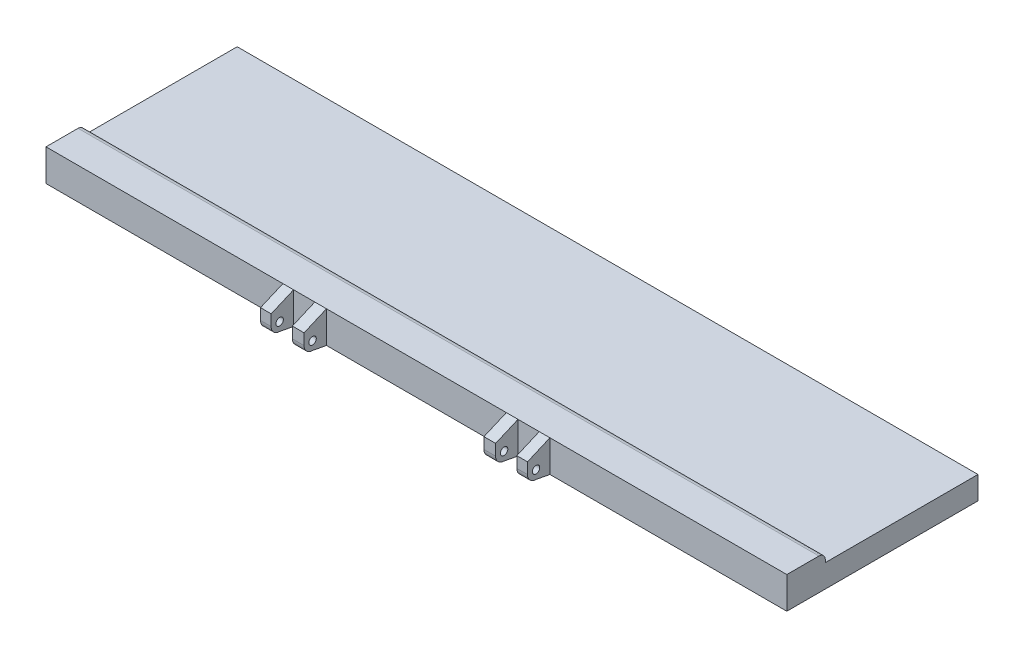
ISO-10303-21;
HEADER;
FILE_DESCRIPTION(('STEP AP214'),'2;1');
FILE_NAME('part.step','',(''),(''),'','','');
FILE_SCHEMA(('AUTOMOTIVE_DESIGN { 1 0 10303 214 1 1 1 1 }'));
ENDSEC;
DATA;
#1=APPLICATION_CONTEXT('core data for automotive mechanical design processes');
#2=APPLICATION_PROTOCOL_DEFINITION('international standard','automotive_design',2000,#1);
#3=PRODUCT_CONTEXT('',#1,'mechanical');
#4=PRODUCT('Part','Part','',(#3));
#5=PRODUCT_RELATED_PRODUCT_CATEGORY('part','',(#4));
#6=PRODUCT_DEFINITION_FORMATION('','',#4);
#7=PRODUCT_DEFINITION_CONTEXT('part definition',#1,'design');
#8=PRODUCT_DEFINITION('design','',#6,#7);
#9=PRODUCT_DEFINITION_SHAPE('','',#8);
#10=(LENGTH_UNIT() NAMED_UNIT(*) SI_UNIT(.MILLI.,.METRE.));
#11=(NAMED_UNIT(*) PLANE_ANGLE_UNIT() SI_UNIT($,.RADIAN.));
#12=(NAMED_UNIT(*) SI_UNIT($,.STERADIAN.) SOLID_ANGLE_UNIT());
#13=UNCERTAINTY_MEASURE_WITH_UNIT(LENGTH_MEASURE(1.E-05),#10,'distance_accuracy_value','');
#14=(GEOMETRIC_REPRESENTATION_CONTEXT(3) GLOBAL_UNCERTAINTY_ASSIGNED_CONTEXT((#13)) GLOBAL_UNIT_ASSIGNED_CONTEXT((#10,
#11,#12)) REPRESENTATION_CONTEXT('',''));
#15=CARTESIAN_POINT('',(0.,0.,0.));
#16=DIRECTION('',(0.,0.,1.));
#17=DIRECTION('',(1.,0.,0.));
#18=AXIS2_PLACEMENT_3D('',#15,#16,#17);
#19=CARTESIAN_POINT('',(-104.943162,25.,0.));
#20=DIRECTION('',(1.,0.,0.));
#21=DIRECTION('',(0.,0.,-1.));
#22=AXIS2_PLACEMENT_3D('',#19,#20,#21);
#23=PLANE('',#22);
#24=CARTESIAN_POINT('',(-104.943162,8.74871946340382,87.8824389342233));
#25=DIRECTION('',(1.,0.,0.));
#26=DIRECTION('',(0.,0.,-1.));
#27=AXIS2_PLACEMENT_3D('',#24,#25,#26);
#28=CIRCLE('',#27,2.91102849999999);
#29=CARTESIAN_POINT('',(-104.943162,8.74871946340382,84.9714104342233));
#30=VERTEX_POINT('',#29);
#31=EDGE_CURVE('E248',#30,#30,#28,.T.);
#32=ORIENTED_EDGE('',*,*,#31,.T.);
#33=EDGE_LOOP('',(#32));
#34=FACE_BOUND('',#33,.T.);
#35=DIRECTION('',(0.,-0.186256622322147,-0.982501130096625));
#36=VECTOR('',#35,1.);
#37=CARTESIAN_POINT('',(-104.943162,-13.2134422400238,7.24427327450433));
#38=LINE('',#37,#36);
#39=CARTESIAN_POINT('',(-104.943162,2.07345352624965,87.8824389342233));
#40=VERTEX_POINT('',#39);
#41=CARTESIAN_POINT('',(-104.943162,0.,76.945));
#42=VERTEX_POINT('',#41);
#43=EDGE_CURVE('E382',#40,#42,#38,.T.);
#44=ORIENTED_EDGE('',*,*,#43,.F.);
#45=CARTESIAN_POINT('',(-104.943162,8.73288769143077,87.8982707061963));
#46=DIRECTION('',(1.,0.,0.));
#47=DIRECTION('',(0.,0.,-1.));
#48=AXIS2_PLACEMENT_3D('',#45,#46,#47);
#49=CIRCLE('',#48,6.65945298394586);
#50=CARTESIAN_POINT('',(-104.943162,8.71705591945721,94.5577048713775));
#51=VERTEX_POINT('',#50);
#52=EDGE_CURVE('E417',#40,#51,#49,.F.);
#53=ORIENTED_EDGE('',*,*,#52,.T.);
#54=DIRECTION('',(0.,-1.,0.));
#55=VECTOR('',#54,1.);
#56=CARTESIAN_POINT('',(-104.943162,25.,94.5577048713773));
#57=LINE('',#56,#55);
#58=CARTESIAN_POINT('',(-104.943162,17.4341118389154,94.5577048713775));
#59=VERTEX_POINT('',#58);
#60=EDGE_CURVE('E298',#59,#51,#57,.T.);
#61=ORIENTED_EDGE('',*,*,#60,.F.);
#62=DIRECTION('',(0.,0.39469422298178,-0.91881253275345));
#63=VECTOR('',#62,1.);
#64=CARTESIAN_POINT('',(-104.943162,52.9041041485132,11.9867636893188));
#65=LINE('',#64,#63);
#66=CARTESIAN_POINT('',(-104.943162,25.,76.9450000000003));
#67=VERTEX_POINT('',#66);
#68=EDGE_CURVE('E399',#59,#67,#65,.T.);
#69=ORIENTED_EDGE('',*,*,#68,.T.);
#70=DIRECTION('',(0.,-1.,0.));
#71=VECTOR('',#70,1.);
#72=CARTESIAN_POINT('',(-104.943162,25.,76.945));
#73=LINE('',#72,#71);
#74=EDGE_CURVE('E301',#67,#42,#73,.T.);
#75=ORIENTED_EDGE('',*,*,#74,.T.);
#76=EDGE_LOOP('',(#44,#53,#61,#69,#75));
#77=FACE_BOUND('',#76,.T.);
#78=ADVANCED_FACE('F44',(#34,#77),#23,.F.);
#79=CARTESIAN_POINT('',(-96.552372,25.,0.));
#80=DIRECTION('',(1.,0.,0.));
#81=DIRECTION('',(0.,0.,-1.));
#82=AXIS2_PLACEMENT_3D('',#79,#80,#81);
#83=PLANE('',#82);
#84=CARTESIAN_POINT('',(-96.552372,8.74871946340382,87.8824389342233));
#85=DIRECTION('',(1.,0.,0.));
#86=DIRECTION('',(0.,0.,-1.));
#87=AXIS2_PLACEMENT_3D('',#84,#85,#86);
#88=CIRCLE('',#87,2.91102849999999);
#89=CARTESIAN_POINT('',(-96.552372,8.74871946340382,84.9714104342233));
#90=VERTEX_POINT('',#89);
#91=EDGE_CURVE('E438',#90,#90,#88,.T.);
#92=ORIENTED_EDGE('',*,*,#91,.F.);
#93=EDGE_LOOP('',(#92));
#94=FACE_BOUND('',#93,.T.);
#95=CARTESIAN_POINT('',(-96.552372,8.73288769143077,87.8982707061963));
#96=DIRECTION('',(1.,0.,0.));
#97=DIRECTION('',(0.,0.,-1.));
#98=AXIS2_PLACEMENT_3D('',#95,#96,#97);
#99=CIRCLE('',#98,6.65945298394586);
#100=CARTESIAN_POINT('',(-96.552372,2.07345352624965,87.8824389342233));
#101=VERTEX_POINT('',#100);
#102=CARTESIAN_POINT('',(-96.552372,8.71705591945721,94.5577048713775));
#103=VERTEX_POINT('',#102);
#104=EDGE_CURVE('E415',#101,#103,#99,.F.);
#105=ORIENTED_EDGE('',*,*,#104,.F.);
#106=DIRECTION('',(0.,-0.186256622322147,-0.982501130096625));
#107=VECTOR('',#106,1.);
#108=CARTESIAN_POINT('',(-96.552372,-13.2134422400238,7.24427327450433));
#109=LINE('',#108,#107);
#110=CARTESIAN_POINT('',(-96.552372,0.,76.9450000000003));
#111=VERTEX_POINT('',#110);
#112=EDGE_CURVE('E379',#101,#111,#109,.T.);
#113=ORIENTED_EDGE('',*,*,#112,.T.);
#114=DIRECTION('',(0.,-1.,0.));
#115=VECTOR('',#114,1.);
#116=CARTESIAN_POINT('',(-96.552372,25.,76.945));
#117=LINE('',#116,#115);
#118=CARTESIAN_POINT('',(-96.552372,25.,76.945));
#119=VERTEX_POINT('',#118);
#120=EDGE_CURVE('E292',#119,#111,#117,.T.);
#121=ORIENTED_EDGE('',*,*,#120,.F.);
#122=DIRECTION('',(0.,0.39469422298178,-0.91881253275345));
#123=VECTOR('',#122,1.);
#124=CARTESIAN_POINT('',(-96.552372,52.9041041485132,11.9867636893188));
#125=LINE('',#124,#123);
#126=CARTESIAN_POINT('',(-96.552372,17.4341118389154,94.5577048713775));
#127=VERTEX_POINT('',#126);
#128=EDGE_CURVE('E397',#127,#119,#125,.T.);
#129=ORIENTED_EDGE('',*,*,#128,.F.);
#130=DIRECTION('',(0.,-1.,0.));
#131=VECTOR('',#130,1.);
#132=CARTESIAN_POINT('',(-96.552372,25.,94.5577048713773));
#133=LINE('',#132,#131);
#134=EDGE_CURVE('E295',#127,#103,#133,.T.);
#135=ORIENTED_EDGE('',*,*,#134,.T.);
#136=EDGE_LOOP('',(#105,#113,#121,#129,#135));
#137=FACE_BOUND('',#136,.T.);
#138=ADVANCED_FACE('F494',(#94,#137),#83,.T.);
#139=CARTESIAN_POINT('',(-79.86659,25.,0.));
#140=DIRECTION('',(1.,0.,0.));
#141=DIRECTION('',(0.,0.,-1.));
#142=AXIS2_PLACEMENT_3D('',#139,#140,#141);
#143=PLANE('',#142);
#144=CARTESIAN_POINT('',(-79.86659,8.74871946340382,87.8824389342232));
#145=DIRECTION('',(1.,0.,0.));
#146=DIRECTION('',(0.,0.,-1.));
#147=AXIS2_PLACEMENT_3D('',#144,#145,#146);
#148=CIRCLE('',#147,2.91102849999999);
#149=CARTESIAN_POINT('',(-79.86659,8.74871946340382,84.9714104342233));
#150=VERTEX_POINT('',#149);
#151=EDGE_CURVE('E435',#150,#150,#148,.T.);
#152=ORIENTED_EDGE('',*,*,#151,.T.);
#153=EDGE_LOOP('',(#152));
#154=FACE_BOUND('',#153,.T.);
#155=DIRECTION('',(0.,-0.186256622322147,-0.982501130096625));
#156=VECTOR('',#155,1.);
#157=CARTESIAN_POINT('',(-79.86659,-13.2134422400238,7.24427327450433));
#158=LINE('',#157,#156);
#159=CARTESIAN_POINT('',(-79.86659,2.07345352624965,87.8824389342232));
#160=VERTEX_POINT('',#159);
#161=CARTESIAN_POINT('',(-79.86659,0.,76.945));
#162=VERTEX_POINT('',#161);
#163=EDGE_CURVE('E377',#160,#162,#158,.T.);
#164=ORIENTED_EDGE('',*,*,#163,.F.);
#165=CARTESIAN_POINT('',(-79.86659,8.73288769143077,87.8982707061963));
#166=DIRECTION('',(1.,0.,0.));
#167=DIRECTION('',(0.,0.,-1.));
#168=AXIS2_PLACEMENT_3D('',#165,#166,#167);
#169=CIRCLE('',#168,6.65945298394586);
#170=CARTESIAN_POINT('',(-79.86659,8.71705591945721,94.5577048713774));
#171=VERTEX_POINT('',#170);
#172=EDGE_CURVE('E412',#160,#171,#169,.F.);
#173=ORIENTED_EDGE('',*,*,#172,.T.);
#174=DIRECTION('',(0.,-1.,0.));
#175=VECTOR('',#174,1.);
#176=CARTESIAN_POINT('',(-79.86659,25.,94.5577048713773));
#177=LINE('',#176,#175);
#178=CARTESIAN_POINT('',(-79.86659,17.4341118389154,94.5577048713774));
#179=VERTEX_POINT('',#178);
#180=EDGE_CURVE('E286',#179,#171,#177,.T.);
#181=ORIENTED_EDGE('',*,*,#180,.F.);
#182=DIRECTION('',(0.,0.39469422298178,-0.91881253275345));
#183=VECTOR('',#182,1.);
#184=CARTESIAN_POINT('',(-79.86659,52.9041041485131,11.9867636893188));
#185=LINE('',#184,#183);
#186=CARTESIAN_POINT('',(-79.86659,25.,76.9450000000003));
#187=VERTEX_POINT('',#186);
#188=EDGE_CURVE('E394',#179,#187,#185,.T.);
#189=ORIENTED_EDGE('',*,*,#188,.T.);
#190=DIRECTION('',(0.,-1.,0.));
#191=VECTOR('',#190,1.);
#192=CARTESIAN_POINT('',(-79.86659,25.,76.945));
#193=LINE('',#192,#191);
#194=EDGE_CURVE('E289',#187,#162,#193,.T.);
#195=ORIENTED_EDGE('',*,*,#194,.T.);
#196=EDGE_LOOP('',(#164,#173,#181,#189,#195));
#197=FACE_BOUND('',#196,.T.);
#198=ADVANCED_FACE('F531',(#154,#197),#143,.F.);
#199=CARTESIAN_POINT('',(-70.69296,25.,0.));
#200=DIRECTION('',(1.,0.,0.));
#201=DIRECTION('',(0.,0.,-1.));
#202=AXIS2_PLACEMENT_3D('',#199,#200,#201);
#203=PLANE('',#202);
#204=CARTESIAN_POINT('',(-70.69296,8.74871946340382,87.8824389342232));
#205=DIRECTION('',(1.,0.,0.));
#206=DIRECTION('',(0.,0.,-1.));
#207=AXIS2_PLACEMENT_3D('',#204,#205,#206);
#208=CIRCLE('',#207,2.91102849999999);
#209=CARTESIAN_POINT('',(-70.69296,8.74871946340382,84.9714104342232));
#210=VERTEX_POINT('',#209);
#211=EDGE_CURVE('E432',#210,#210,#208,.T.);
#212=ORIENTED_EDGE('',*,*,#211,.F.);
#213=EDGE_LOOP('',(#212));
#214=FACE_BOUND('',#213,.T.);
#215=CARTESIAN_POINT('',(-70.69296,8.73288769143077,87.8982707061963));
#216=DIRECTION('',(1.,0.,0.));
#217=DIRECTION('',(0.,0.,-1.));
#218=AXIS2_PLACEMENT_3D('',#215,#216,#217);
#219=CIRCLE('',#218,6.65945298394586);
#220=CARTESIAN_POINT('',(-70.69296,2.07345352624965,87.8824389342232));
#221=VERTEX_POINT('',#220);
#222=CARTESIAN_POINT('',(-70.69296,8.71705591945721,94.5577048713774));
#223=VERTEX_POINT('',#222);
#224=EDGE_CURVE('E410',#221,#223,#219,.F.);
#225=ORIENTED_EDGE('',*,*,#224,.F.);
#226=DIRECTION('',(0.,-0.186256622322147,-0.982501130096625));
#227=VECTOR('',#226,1.);
#228=CARTESIAN_POINT('',(-70.69296,-13.2134422400238,7.24427327450433));
#229=LINE('',#228,#227);
#230=CARTESIAN_POINT('',(-70.69296,0.,76.9450000000003));
#231=VERTEX_POINT('',#230);
#232=EDGE_CURVE('E374',#221,#231,#229,.T.);
#233=ORIENTED_EDGE('',*,*,#232,.T.);
#234=DIRECTION('',(0.,-1.,0.));
#235=VECTOR('',#234,1.);
#236=CARTESIAN_POINT('',(-70.69296,25.,76.945));
#237=LINE('',#236,#235);
#238=CARTESIAN_POINT('',(-70.69296,25.,76.945));
#239=VERTEX_POINT('',#238);
#240=EDGE_CURVE('E280',#239,#231,#237,.T.);
#241=ORIENTED_EDGE('',*,*,#240,.F.);
#242=DIRECTION('',(0.,0.39469422298178,-0.91881253275345));
#243=VECTOR('',#242,1.);
#244=CARTESIAN_POINT('',(-70.69296,52.9041041485131,11.9867636893188));
#245=LINE('',#244,#243);
#246=CARTESIAN_POINT('',(-70.69296,17.4341118389154,94.5577048713774));
#247=VERTEX_POINT('',#246);
#248=EDGE_CURVE('E392',#247,#239,#245,.T.);
#249=ORIENTED_EDGE('',*,*,#248,.F.);
#250=DIRECTION('',(0.,-1.,0.));
#251=VECTOR('',#250,1.);
#252=CARTESIAN_POINT('',(-70.69296,25.,94.5577048713773));
#253=LINE('',#252,#251);
#254=EDGE_CURVE('E283',#247,#223,#253,.T.);
#255=ORIENTED_EDGE('',*,*,#254,.T.);
#256=EDGE_LOOP('',(#225,#233,#241,#249,#255));
#257=FACE_BOUND('',#256,.T.);
#258=ADVANCED_FACE('F597',(#214,#257),#203,.T.);
#259=CARTESIAN_POINT('',(70.6929599999999,25.,-1.11403887767481E-13));
#260=DIRECTION('',(1.,0.,0.));
#261=DIRECTION('',(0.,0.,-1.));
#262=AXIS2_PLACEMENT_3D('',#259,#260,#261);
#263=PLANE('',#262);
#264=CARTESIAN_POINT('',(70.69296,8.74871946340382,87.882438934223));
#265=DIRECTION('',(1.,0.,0.));
#266=DIRECTION('',(0.,0.,-1.));
#267=AXIS2_PLACEMENT_3D('',#264,#265,#266);
#268=CIRCLE('',#267,2.91102849999999);
#269=CARTESIAN_POINT('',(70.69296,8.74871946340382,84.971410434223));
#270=VERTEX_POINT('',#269);
#271=EDGE_CURVE('E429',#270,#270,#268,.T.);
#272=ORIENTED_EDGE('',*,*,#271,.T.);
#273=EDGE_LOOP('',(#272));
#274=FACE_BOUND('',#273,.T.);
#275=DIRECTION('',(0.,-0.186256622322147,-0.982501130096625));
#276=VECTOR('',#275,1.);
#277=CARTESIAN_POINT('',(70.6929599999999,-13.2134422400238,7.24427327450421));
#278=LINE('',#277,#276);
#279=CARTESIAN_POINT('',(70.69296,2.07345352624965,87.882438934223));
#280=VERTEX_POINT('',#279);
#281=CARTESIAN_POINT('',(70.69296,0.,76.945));
#282=VERTEX_POINT('',#281);
#283=EDGE_CURVE('E372',#280,#282,#278,.T.);
#284=ORIENTED_EDGE('',*,*,#283,.F.);
#285=CARTESIAN_POINT('',(70.69296,8.73288769143077,87.8982707061961));
#286=DIRECTION('',(1.,0.,0.));
#287=DIRECTION('',(0.,0.,-1.));
#288=AXIS2_PLACEMENT_3D('',#285,#286,#287);
#289=CIRCLE('',#288,6.65945298394586);
#290=CARTESIAN_POINT('',(70.69296,8.71705591945721,94.5577048713772));
#291=VERTEX_POINT('',#290);
#292=EDGE_CURVE('E407',#280,#291,#289,.F.);
#293=ORIENTED_EDGE('',*,*,#292,.T.);
#294=DIRECTION('',(0.,-1.,0.));
#295=VECTOR('',#294,1.);
#296=CARTESIAN_POINT('',(70.69296,25.,94.5577048713772));
#297=LINE('',#296,#295);
#298=CARTESIAN_POINT('',(70.69296,17.4341118389154,94.5577048713772));
#299=VERTEX_POINT('',#298);
#300=EDGE_CURVE('E274',#299,#291,#297,.T.);
#301=ORIENTED_EDGE('',*,*,#300,.F.);
#302=DIRECTION('',(0.,0.39469422298178,-0.91881253275345));
#303=VECTOR('',#302,1.);
#304=CARTESIAN_POINT('',(70.6929599999999,52.9041041485131,11.9867636893186));
#305=LINE('',#304,#303);
#306=CARTESIAN_POINT('',(70.69296,25.,76.9450000000001));
#307=VERTEX_POINT('',#306);
#308=EDGE_CURVE('E389',#299,#307,#305,.T.);
#309=ORIENTED_EDGE('',*,*,#308,.T.);
#310=DIRECTION('',(0.,-1.,0.));
#311=VECTOR('',#310,1.);
#312=CARTESIAN_POINT('',(70.69296,25.,76.945));
#313=LINE('',#312,#311);
#314=EDGE_CURVE('E277',#307,#282,#313,.T.);
#315=ORIENTED_EDGE('',*,*,#314,.T.);
#316=EDGE_LOOP('',(#284,#293,#301,#309,#315));
#317=FACE_BOUND('',#316,.T.);
#318=ADVANCED_FACE('F470',(#274,#317),#263,.F.);
#319=CARTESIAN_POINT('',(79.8665899999999,25.,-1.2586046232512E-13));
#320=DIRECTION('',(1.,0.,0.));
#321=DIRECTION('',(0.,0.,-1.));
#322=AXIS2_PLACEMENT_3D('',#319,#320,#321);
#323=PLANE('',#322);
#324=CARTESIAN_POINT('',(79.86659,8.74871946340382,87.882438934223));
#325=DIRECTION('',(1.,0.,0.));
#326=DIRECTION('',(0.,0.,-1.));
#327=AXIS2_PLACEMENT_3D('',#324,#325,#326);
#328=CIRCLE('',#327,2.91102849999999);
#329=CARTESIAN_POINT('',(79.86659,8.74871946340382,84.971410434223));
#330=VERTEX_POINT('',#329);
#331=EDGE_CURVE('E426',#330,#330,#328,.T.);
#332=ORIENTED_EDGE('',*,*,#331,.F.);
#333=EDGE_LOOP('',(#332));
#334=FACE_BOUND('',#333,.T.);
#335=CARTESIAN_POINT('',(79.86659,8.73288769143077,87.898270706196));
#336=DIRECTION('',(1.,0.,0.));
#337=DIRECTION('',(0.,0.,-1.));
#338=AXIS2_PLACEMENT_3D('',#335,#336,#337);
#339=CIRCLE('',#338,6.65945298394586);
#340=CARTESIAN_POINT('',(79.86659,2.07345352624965,87.882438934223));
#341=VERTEX_POINT('',#340);
#342=CARTESIAN_POINT('',(79.86659,8.71705591945721,94.5577048713772));
#343=VERTEX_POINT('',#342);
#344=EDGE_CURVE('E405',#341,#343,#339,.F.);
#345=ORIENTED_EDGE('',*,*,#344,.F.);
#346=DIRECTION('',(0.,-0.186256622322147,-0.982501130096625));
#347=VECTOR('',#346,1.);
#348=CARTESIAN_POINT('',(79.8665899999999,-13.2134422400238,7.2442732745042));
#349=LINE('',#348,#347);
#350=CARTESIAN_POINT('',(79.86659,0.,76.945));
#351=VERTEX_POINT('',#350);
#352=EDGE_CURVE('E369',#341,#351,#349,.T.);
#353=ORIENTED_EDGE('',*,*,#352,.T.);
#354=DIRECTION('',(0.,-1.,0.));
#355=VECTOR('',#354,1.);
#356=CARTESIAN_POINT('',(79.86659,25.,76.945));
#357=LINE('',#356,#355);
#358=CARTESIAN_POINT('',(79.86659,25.,76.945));
#359=VERTEX_POINT('',#358);
#360=EDGE_CURVE('E268',#359,#351,#357,.T.);
#361=ORIENTED_EDGE('',*,*,#360,.F.);
#362=DIRECTION('',(0.,0.39469422298178,-0.91881253275345));
#363=VECTOR('',#362,1.);
#364=CARTESIAN_POINT('',(79.8665899999999,52.9041041485131,11.9867636893186));
#365=LINE('',#364,#363);
#366=CARTESIAN_POINT('',(79.86659,17.4341118389154,94.5577048713772));
#367=VERTEX_POINT('',#366);
#368=EDGE_CURVE('E387',#367,#359,#365,.T.);
#369=ORIENTED_EDGE('',*,*,#368,.F.);
#370=DIRECTION('',(0.,-1.,0.));
#371=VECTOR('',#370,1.);
#372=CARTESIAN_POINT('',(79.86659,25.,94.5577048713772));
#373=LINE('',#372,#371);
#374=EDGE_CURVE('E271',#367,#343,#373,.T.);
#375=ORIENTED_EDGE('',*,*,#374,.T.);
#376=EDGE_LOOP('',(#345,#353,#361,#369,#375));
#377=FACE_BOUND('',#376,.T.);
#378=ADVANCED_FACE('F506',(#334,#377),#323,.T.);
#379=CARTESIAN_POINT('',(96.5523719999999,25.,-1.52155315238912E-13));
#380=DIRECTION('',(1.,0.,0.));
#381=DIRECTION('',(0.,0.,-1.));
#382=AXIS2_PLACEMENT_3D('',#379,#380,#381);
#383=PLANE('',#382);
#384=CARTESIAN_POINT('',(96.552372,8.74871946340382,87.882438934223));
#385=DIRECTION('',(1.,0.,0.));
#386=DIRECTION('',(0.,0.,-1.));
#387=AXIS2_PLACEMENT_3D('',#384,#385,#386);
#388=CIRCLE('',#387,2.91102849999999);
#389=CARTESIAN_POINT('',(96.552372,8.74871946340382,84.971410434223));
#390=VERTEX_POINT('',#389);
#391=EDGE_CURVE('E423',#390,#390,#388,.T.);
#392=ORIENTED_EDGE('',*,*,#391,.T.);
#393=EDGE_LOOP('',(#392));
#394=FACE_BOUND('',#393,.T.);
#395=DIRECTION('',(0.,-0.186256622322147,-0.982501130096625));
#396=VECTOR('',#395,1.);
#397=CARTESIAN_POINT('',(96.5523719999999,-13.2134422400238,7.24427327450417));
#398=LINE('',#397,#396);
#399=CARTESIAN_POINT('',(96.552372,2.07345352624965,87.882438934223));
#400=VERTEX_POINT('',#399);
#401=CARTESIAN_POINT('',(96.552372,0.,76.945));
#402=VERTEX_POINT('',#401);
#403=EDGE_CURVE('E367',#400,#402,#398,.T.);
#404=ORIENTED_EDGE('',*,*,#403,.F.);
#405=CARTESIAN_POINT('',(96.552372,8.73288769143077,87.898270706196));
#406=DIRECTION('',(1.,0.,0.));
#407=DIRECTION('',(0.,0.,-1.));
#408=AXIS2_PLACEMENT_3D('',#405,#406,#407);
#409=CIRCLE('',#408,6.65945298394586);
#410=CARTESIAN_POINT('',(96.552372,8.71705591945721,94.5577048713771));
#411=VERTEX_POINT('',#410);
#412=EDGE_CURVE('E402',#400,#411,#409,.F.);
#413=ORIENTED_EDGE('',*,*,#412,.T.);
#414=DIRECTION('',(0.,-1.,0.));
#415=VECTOR('',#414,1.);
#416=CARTESIAN_POINT('',(96.552372,25.,94.5577048713771));
#417=LINE('',#416,#415);
#418=CARTESIAN_POINT('',(96.552372,17.4341118389154,94.5577048713771));
#419=VERTEX_POINT('',#418);
#420=EDGE_CURVE('E262',#419,#411,#417,.T.);
#421=ORIENTED_EDGE('',*,*,#420,.F.);
#422=DIRECTION('',(0.,0.39469422298178,-0.91881253275345));
#423=VECTOR('',#422,1.);
#424=CARTESIAN_POINT('',(96.5523719999999,52.9041041485131,11.9867636893186));
#425=LINE('',#424,#423);
#426=CARTESIAN_POINT('',(96.552372,25.,76.945));
#427=VERTEX_POINT('',#426);
#428=EDGE_CURVE('E384',#419,#427,#425,.T.);
#429=ORIENTED_EDGE('',*,*,#428,.T.);
#430=DIRECTION('',(0.,-1.,0.));
#431=VECTOR('',#430,1.);
#432=CARTESIAN_POINT('',(96.552372,25.,76.945));
#433=LINE('',#432,#431);
#434=EDGE_CURVE('E265',#427,#402,#433,.T.);
#435=ORIENTED_EDGE('',*,*,#434,.T.);
#436=EDGE_LOOP('',(#404,#413,#421,#429,#435));
#437=FACE_BOUND('',#436,.T.);
#438=ADVANCED_FACE('F514',(#394,#437),#383,.F.);
#439=CARTESIAN_POINT('',(104.943162,25.,-1.65378224952135E-13));
#440=DIRECTION('',(1.,0.,0.));
#441=DIRECTION('',(0.,0.,-1.));
#442=AXIS2_PLACEMENT_3D('',#439,#440,#441);
#443=PLANE('',#442);
#444=CARTESIAN_POINT('',(104.943162,8.74871946340382,87.882438934223));
#445=DIRECTION('',(1.,0.,0.));
#446=DIRECTION('',(0.,0.,-1.));
#447=AXIS2_PLACEMENT_3D('',#444,#445,#446);
#448=CIRCLE('',#447,2.91102849999999);
#449=CARTESIAN_POINT('',(104.943162,8.74871946340382,84.971410434223));
#450=VERTEX_POINT('',#449);
#451=EDGE_CURVE('E420',#450,#450,#448,.T.);
#452=ORIENTED_EDGE('',*,*,#451,.F.);
#453=EDGE_LOOP('',(#452));
#454=FACE_BOUND('',#453,.T.);
#455=CARTESIAN_POINT('',(104.943162,8.73288769143077,87.898270706196));
#456=DIRECTION('',(1.,0.,0.));
#457=DIRECTION('',(0.,0.,-1.));
#458=AXIS2_PLACEMENT_3D('',#455,#456,#457);
#459=CIRCLE('',#458,6.65945298394586);
#460=CARTESIAN_POINT('',(104.943162,2.07345352624965,87.882438934223));
#461=VERTEX_POINT('',#460);
#462=CARTESIAN_POINT('',(104.943162,8.71705591945721,94.5577048713771));
#463=VERTEX_POINT('',#462);
#464=EDGE_CURVE('E351',#461,#463,#459,.F.);
#465=ORIENTED_EDGE('',*,*,#464,.F.);
#466=DIRECTION('',(0.,-0.186256622322147,-0.982501130096625));
#467=VECTOR('',#466,1.);
#468=CARTESIAN_POINT('',(104.943162,-14.0807304739951,2.66933972651691));
#469=LINE('',#468,#467);
#470=CARTESIAN_POINT('',(104.943162,0.,76.945));
#471=VERTEX_POINT('',#470);
#472=EDGE_CURVE('E348',#461,#471,#469,.T.);
#473=ORIENTED_EDGE('',*,*,#472,.T.);
#474=DIRECTION('',(0.,-1.,0.));
#475=VECTOR('',#474,1.);
#476=CARTESIAN_POINT('',(104.943162,25.,76.945));
#477=LINE('',#476,#475);
#478=CARTESIAN_POINT('',(104.943162,25.,76.945));
#479=VERTEX_POINT('',#478);
#480=EDGE_CURVE('E255',#479,#471,#477,.T.);
#481=ORIENTED_EDGE('',*,*,#480,.F.);
#482=DIRECTION('',(0.,0.39469422298178,-0.91881253275345));
#483=VECTOR('',#482,1.);
#484=CARTESIAN_POINT('',(104.943162,49.0095159071333,21.0530136563447));
#485=LINE('',#484,#483);
#486=CARTESIAN_POINT('',(104.943162,17.4341118389154,94.5577048713771));
#487=VERTEX_POINT('',#486);
#488=EDGE_CURVE('E343',#487,#479,#485,.T.);
#489=ORIENTED_EDGE('',*,*,#488,.F.);
#490=DIRECTION('',(0.,-1.,0.));
#491=VECTOR('',#490,1.);
#492=CARTESIAN_POINT('',(104.943162,25.,94.5577048713771));
#493=LINE('',#492,#491);
#494=EDGE_CURVE('E259',#487,#463,#493,.T.);
#495=ORIENTED_EDGE('',*,*,#494,.T.);
#496=EDGE_LOOP('',(#465,#473,#481,#489,#495));
#497=FACE_BOUND('',#496,.T.);
#498=ADVANCED_FACE('F525',(#454,#497),#443,.T.);
#499=CARTESIAN_POINT('',(0.,0.,0.));
#500=DIRECTION('',(0.,1.,0.));
#501=DIRECTION('',(0.,0.,1.));
#502=AXIS2_PLACEMENT_3D('',#499,#500,#501);
#503=PLANE('',#502);
#504=DIRECTION('',(0.,0.,1.));
#505=VECTOR('',#504,1.);
#506=CARTESIAN_POINT('',(-291.17,0.,0.));
#507=LINE('',#506,#505);
#508=CARTESIAN_POINT('',(-291.17,0.,-73.3326422229955));
#509=VERTEX_POINT('',#508);
#510=CARTESIAN_POINT('',(-291.17,0.,76.945));
#511=VERTEX_POINT('',#510);
#512=EDGE_CURVE('E233',#509,#511,#507,.T.);
#513=ORIENTED_EDGE('',*,*,#512,.F.);
#514=DIRECTION('',(1.,0.,0.));
#515=VECTOR('',#514,1.);
#516=CARTESIAN_POINT('',(-291.17,0.,-73.3326422229955));
#517=LINE('',#516,#515);
#518=CARTESIAN_POINT('',(291.17,0.,-73.3326422229955));
#519=VERTEX_POINT('',#518);
#520=EDGE_CURVE('E220',#509,#519,#517,.T.);
#521=ORIENTED_EDGE('',*,*,#520,.T.);
#522=DIRECTION('',(0.,0.,1.));
#523=VECTOR('',#522,1.);
#524=CARTESIAN_POINT('',(291.17,0.,0.));
#525=LINE('',#524,#523);
#526=CARTESIAN_POINT('',(291.17,0.,76.945));
#527=VERTEX_POINT('',#526);
#528=EDGE_CURVE('E243',#519,#527,#525,.T.);
#529=ORIENTED_EDGE('',*,*,#528,.T.);
#530=DIRECTION('',(1.,0.,0.));
#531=VECTOR('',#530,1.);
#532=CARTESIAN_POINT('',(0.,0.,76.945));
#533=LINE('',#532,#531);
#534=EDGE_CURVE('E247',#471,#527,#533,.T.);
#535=ORIENTED_EDGE('',*,*,#534,.F.);
#536=DIRECTION('',(1.,0.,0.));
#537=VECTOR('',#536,1.);
#538=CARTESIAN_POINT('',(1.21256376084247E-13,0.,76.9450000000002));
#539=LINE('',#538,#537);
#540=EDGE_CURVE('E306',#402,#471,#539,.T.);
#541=ORIENTED_EDGE('',*,*,#540,.F.);
#542=EDGE_CURVE('E511',#351,#402,#533,.T.);
#543=ORIENTED_EDGE('',*,*,#542,.F.);
#544=EDGE_CURVE('E308',#282,#351,#539,.T.);
#545=ORIENTED_EDGE('',*,*,#544,.F.);
#546=EDGE_CURVE('E467',#231,#282,#533,.T.);
#547=ORIENTED_EDGE('',*,*,#546,.F.);
#548=EDGE_CURVE('E664',#162,#231,#539,.T.);
#549=ORIENTED_EDGE('',*,*,#548,.F.);
#550=EDGE_CURVE('E245',#111,#162,#533,.T.);
#551=ORIENTED_EDGE('',*,*,#550,.F.);
#552=EDGE_CURVE('E309',#42,#111,#539,.T.);
#553=ORIENTED_EDGE('',*,*,#552,.F.);
#554=EDGE_CURVE('E242',#511,#42,#533,.T.);
#555=ORIENTED_EDGE('',*,*,#554,.F.);
#556=EDGE_LOOP('',(#513,#521,#529,#535,#541,#543,#545,#547,#549,#551,#553,#555));
#557=FACE_BOUND('',#556,.T.);
#558=ADVANCED_FACE('F239',(#557),#503,.F.);
#559=CARTESIAN_POINT('',(291.17,25.,0.));
#560=DIRECTION('',(1.,0.,0.));
#561=DIRECTION('',(0.,0.,-1.));
#562=AXIS2_PLACEMENT_3D('',#559,#560,#561);
#563=PLANE('',#562);
#564=DIRECTION('',(0.,1.,0.));
#565=VECTOR('',#564,1.);
#566=CARTESIAN_POINT('',(291.17,0.,-73.3326422229955));
#567=LINE('',#566,#565);
#568=CARTESIAN_POINT('',(291.17,18.,-73.3326422229955));
#569=VERTEX_POINT('',#568);
#570=EDGE_CURVE('E223',#519,#569,#567,.T.);
#571=ORIENTED_EDGE('',*,*,#570,.T.);
#572=DIRECTION('',(0.,0.,-1.));
#573=VECTOR('',#572,1.);
#574=CARTESIAN_POINT('',(291.17,18.,46.7170680224697));
#575=LINE('',#574,#573);
#576=CARTESIAN_POINT('',(291.17,18.,46.7170680224697));
#577=VERTEX_POINT('',#576);
#578=EDGE_CURVE('E341',#577,#569,#575,.T.);
#579=ORIENTED_EDGE('',*,*,#578,.F.);
#580=DIRECTION('',(0.,1.,0.));
#581=VECTOR('',#580,1.);
#582=CARTESIAN_POINT('',(291.17,18.,46.7170680224697));
#583=LINE('',#582,#581);
#584=CARTESIAN_POINT('',(291.17,20.,46.7170680224697));
#585=VERTEX_POINT('',#584);
#586=EDGE_CURVE('E324',#577,#585,#583,.T.);
#587=ORIENTED_EDGE('',*,*,#586,.T.);
#588=CARTESIAN_POINT('',(291.17,20.,51.7170680224697));
#589=DIRECTION('',(1.,0.,0.));
#590=DIRECTION('',(0.,0.,-1.));
#591=AXIS2_PLACEMENT_3D('',#588,#589,#590);
#592=CIRCLE('',#591,5.);
#593=CARTESIAN_POINT('',(291.17,25.,51.7170680224697));
#594=VERTEX_POINT('',#593);
#595=EDGE_CURVE('E317',#585,#594,#592,.T.);
#596=ORIENTED_EDGE('',*,*,#595,.T.);
#597=DIRECTION('',(0.,0.,1.));
#598=VECTOR('',#597,1.);
#599=CARTESIAN_POINT('',(291.17,25.,0.));
#600=LINE('',#599,#598);
#601=CARTESIAN_POINT('',(291.17,25.,76.945));
#602=VERTEX_POINT('',#601);
#603=EDGE_CURVE('E321',#594,#602,#600,.T.);
#604=ORIENTED_EDGE('',*,*,#603,.T.);
#605=DIRECTION('',(0.,-1.,0.));
#606=VECTOR('',#605,1.);
#607=CARTESIAN_POINT('',(291.17,25.,76.945));
#608=LINE('',#607,#606);
#609=EDGE_CURVE('E252',#602,#527,#608,.T.);
#610=ORIENTED_EDGE('',*,*,#609,.T.);
#611=ORIENTED_EDGE('',*,*,#528,.F.);
#612=EDGE_LOOP('',(#571,#579,#587,#596,#604,#610,#611));
#613=FACE_BOUND('',#612,.T.);
#614=ADVANCED_FACE('F320',(#613),#563,.T.);
#615=CARTESIAN_POINT('',(-291.17,25.,0.));
#616=DIRECTION('',(1.,0.,0.));
#617=DIRECTION('',(0.,0.,-1.));
#618=AXIS2_PLACEMENT_3D('',#615,#616,#617);
#619=PLANE('',#618);
#620=DIRECTION('',(0.,0.,1.));
#621=VECTOR('',#620,1.);
#622=CARTESIAN_POINT('',(-291.17,18.,46.7170680224697));
#623=LINE('',#622,#621);
#624=CARTESIAN_POINT('',(-291.17,18.,-73.3326422229955));
#625=VERTEX_POINT('',#624);
#626=CARTESIAN_POINT('',(-291.17,18.,46.7170680224697));
#627=VERTEX_POINT('',#626);
#628=EDGE_CURVE('E236',#625,#627,#623,.T.);
#629=ORIENTED_EDGE('',*,*,#628,.F.);
#630=DIRECTION('',(0.,1.,0.));
#631=VECTOR('',#630,1.);
#632=CARTESIAN_POINT('',(-291.17,0.,-73.3326422229955));
#633=LINE('',#632,#631);
#634=EDGE_CURVE('E59',#509,#625,#633,.T.);
#635=ORIENTED_EDGE('',*,*,#634,.F.);
#636=ORIENTED_EDGE('',*,*,#512,.T.);
#637=DIRECTION('',(0.,-1.,0.));
#638=VECTOR('',#637,1.);
#639=CARTESIAN_POINT('',(-291.17,25.,76.945));
#640=LINE('',#639,#638);
#641=CARTESIAN_POINT('',(-291.17,25.,76.945));
#642=VERTEX_POINT('',#641);
#643=EDGE_CURVE('E304',#642,#511,#640,.T.);
#644=ORIENTED_EDGE('',*,*,#643,.F.);
#645=DIRECTION('',(0.,0.,1.));
#646=VECTOR('',#645,1.);
#647=CARTESIAN_POINT('',(-291.17,25.,0.));
#648=LINE('',#647,#646);
#649=CARTESIAN_POINT('',(-291.17,25.,51.7170680224697));
#650=VERTEX_POINT('',#649);
#651=EDGE_CURVE('E331',#650,#642,#648,.T.);
#652=ORIENTED_EDGE('',*,*,#651,.F.);
#653=CARTESIAN_POINT('',(-291.17,20.,51.7170680224697));
#654=DIRECTION('',(1.,0.,0.));
#655=DIRECTION('',(0.,0.,-1.));
#656=AXIS2_PLACEMENT_3D('',#653,#654,#655);
#657=CIRCLE('',#656,5.);
#658=CARTESIAN_POINT('',(-291.17,20.,46.7170680224697));
#659=VERTEX_POINT('',#658);
#660=EDGE_CURVE('E11',#650,#659,#657,.F.);
#661=ORIENTED_EDGE('',*,*,#660,.T.);
#662=DIRECTION('',(0.,1.,0.));
#663=VECTOR('',#662,1.);
#664=CARTESIAN_POINT('',(-291.17,18.,46.7170680224697));
#665=LINE('',#664,#663);
#666=EDGE_CURVE('E335',#627,#659,#665,.T.);
#667=ORIENTED_EDGE('',*,*,#666,.F.);
#668=EDGE_LOOP('',(#629,#635,#636,#644,#652,#661,#667));
#669=FACE_BOUND('',#668,.T.);
#670=ADVANCED_FACE('F231',(#669),#619,.F.);
#671=CARTESIAN_POINT('',(0.,25.,76.945));
#672=DIRECTION('',(0.,0.,-1.));
#673=DIRECTION('',(-1.,0.,0.));
#674=AXIS2_PLACEMENT_3D('',#671,#672,#673);
#675=PLANE('',#674);
#676=ORIENTED_EDGE('',*,*,#554,.T.);
#677=ORIENTED_EDGE('',*,*,#74,.F.);
#678=DIRECTION('',(1.,0.,0.));
#679=VECTOR('',#678,1.);
#680=CARTESIAN_POINT('',(0.,25.,76.945));
#681=LINE('',#680,#679);
#682=EDGE_CURVE('E443',#642,#67,#681,.T.);
#683=ORIENTED_EDGE('',*,*,#682,.F.);
#684=ORIENTED_EDGE('',*,*,#643,.T.);
#685=EDGE_LOOP('',(#676,#677,#683,#684));
#686=FACE_BOUND('',#685,.T.);
#687=ADVANCED_FACE('F569',(#686),#675,.F.);
#688=CARTESIAN_POINT('',(0.,25.,94.5577048713773));
#689=DIRECTION('',(0.,0.,1.));
#690=DIRECTION('',(1.,0.,0.));
#691=AXIS2_PLACEMENT_3D('',#688,#689,#690);
#692=PLANE('',#691);
#693=DIRECTION('',(1.,0.,0.));
#694=VECTOR('',#693,1.);
#695=CARTESIAN_POINT('',(-291.17,8.71705591945721,94.5577048713778));
#696=LINE('',#695,#694);
#697=EDGE_CURVE('E360',#51,#103,#696,.T.);
#698=ORIENTED_EDGE('',*,*,#697,.T.);
#699=ORIENTED_EDGE('',*,*,#134,.F.);
#700=DIRECTION('',(1.,0.,0.));
#701=VECTOR('',#700,1.);
#702=CARTESIAN_POINT('',(-291.17,17.4341118389154,94.5577048713778));
#703=LINE('',#702,#701);
#704=EDGE_CURVE('E352',#59,#127,#703,.T.);
#705=ORIENTED_EDGE('',*,*,#704,.F.);
#706=ORIENTED_EDGE('',*,*,#60,.T.);
#707=EDGE_LOOP('',(#698,#699,#705,#706));
#708=FACE_BOUND('',#707,.T.);
#709=ADVANCED_FACE('F497',(#708),#692,.T.);
#710=ORIENTED_EDGE('',*,*,#550,.T.);
#711=ORIENTED_EDGE('',*,*,#194,.F.);
#712=EDGE_CURVE('E445',#119,#187,#681,.T.);
#713=ORIENTED_EDGE('',*,*,#712,.F.);
#714=ORIENTED_EDGE('',*,*,#120,.T.);
#715=EDGE_LOOP('',(#710,#711,#713,#714));
#716=FACE_BOUND('',#715,.T.);
#717=ADVANCED_FACE('F535',(#716),#675,.F.);
#718=CARTESIAN_POINT('',(0.,25.,94.5577048713773));
#719=DIRECTION('',(0.,0.,1.));
#720=DIRECTION('',(1.,0.,0.));
#721=AXIS2_PLACEMENT_3D('',#718,#719,#720);
#722=PLANE('',#721);
#723=EDGE_CURVE('E499',#171,#223,#696,.T.);
#724=ORIENTED_EDGE('',*,*,#723,.T.);
#725=ORIENTED_EDGE('',*,*,#254,.F.);
#726=EDGE_CURVE('E480',#179,#247,#703,.T.);
#727=ORIENTED_EDGE('',*,*,#726,.F.);
#728=ORIENTED_EDGE('',*,*,#180,.T.);
#729=EDGE_LOOP('',(#724,#725,#727,#728));
#730=FACE_BOUND('',#729,.T.);
#731=ADVANCED_FACE('F602',(#730),#722,.T.);
#732=ORIENTED_EDGE('',*,*,#546,.T.);
#733=ORIENTED_EDGE('',*,*,#314,.F.);
#734=EDGE_CURVE('E450',#239,#307,#681,.T.);
#735=ORIENTED_EDGE('',*,*,#734,.F.);
#736=ORIENTED_EDGE('',*,*,#240,.T.);
#737=EDGE_LOOP('',(#732,#733,#735,#736));
#738=FACE_BOUND('',#737,.T.);
#739=ADVANCED_FACE('F465',(#738),#675,.F.);
#740=CARTESIAN_POINT('',(0.,25.,94.5577048713772));
#741=DIRECTION('',(0.,0.,-1.));
#742=DIRECTION('',(-1.,0.,0.));
#743=AXIS2_PLACEMENT_3D('',#740,#741,#742);
#744=PLANE('',#743);
#745=ORIENTED_EDGE('',*,*,#300,.T.);
#746=EDGE_CURVE('E358',#291,#343,#696,.T.);
#747=ORIENTED_EDGE('',*,*,#746,.T.);
#748=ORIENTED_EDGE('',*,*,#374,.F.);
#749=EDGE_CURVE('E366',#299,#367,#703,.T.);
#750=ORIENTED_EDGE('',*,*,#749,.F.);
#751=EDGE_LOOP('',(#745,#747,#748,#750));
#752=FACE_BOUND('',#751,.T.);
#753=ADVANCED_FACE('F478',(#752),#744,.F.);
#754=ORIENTED_EDGE('',*,*,#542,.T.);
#755=ORIENTED_EDGE('',*,*,#434,.F.);
#756=EDGE_CURVE('E451',#359,#427,#681,.T.);
#757=ORIENTED_EDGE('',*,*,#756,.F.);
#758=ORIENTED_EDGE('',*,*,#360,.T.);
#759=EDGE_LOOP('',(#754,#755,#757,#758));
#760=FACE_BOUND('',#759,.T.);
#761=ADVANCED_FACE('F510',(#760),#675,.F.);
#762=CARTESIAN_POINT('',(0.,25.,94.5577048713772));
#763=DIRECTION('',(0.,0.,-1.));
#764=DIRECTION('',(-1.,0.,0.));
#765=AXIS2_PLACEMENT_3D('',#762,#763,#764);
#766=PLANE('',#765);
#767=ORIENTED_EDGE('',*,*,#420,.T.);
#768=EDGE_CURVE('E355',#411,#463,#696,.T.);
#769=ORIENTED_EDGE('',*,*,#768,.T.);
#770=ORIENTED_EDGE('',*,*,#494,.F.);
#771=EDGE_CURVE('E364',#419,#487,#703,.T.);
#772=ORIENTED_EDGE('',*,*,#771,.F.);
#773=EDGE_LOOP('',(#767,#769,#770,#772));
#774=FACE_BOUND('',#773,.T.);
#775=ADVANCED_FACE('F522',(#774),#766,.F.);
#776=ORIENTED_EDGE('',*,*,#534,.T.);
#777=ORIENTED_EDGE('',*,*,#609,.F.);
#778=EDGE_CURVE('E256',#479,#602,#681,.T.);
#779=ORIENTED_EDGE('',*,*,#778,.F.);
#780=ORIENTED_EDGE('',*,*,#480,.T.);
#781=EDGE_LOOP('',(#776,#777,#779,#780));
#782=FACE_BOUND('',#781,.T.);
#783=ADVANCED_FACE('F541',(#782),#675,.F.);
#784=CARTESIAN_POINT('',(0.,25.,0.));
#785=DIRECTION('',(0.,1.,0.));
#786=DIRECTION('',(0.,0.,1.));
#787=AXIS2_PLACEMENT_3D('',#784,#785,#786);
#788=PLANE('',#787);
#789=ORIENTED_EDGE('',*,*,#603,.F.);
#790=DIRECTION('',(1.,0.,0.));
#791=VECTOR('',#790,1.);
#792=CARTESIAN_POINT('',(-291.17,25.,51.7170680224697));
#793=LINE('',#792,#791);
#794=EDGE_CURVE('E52',#594,#650,#793,.F.);
#795=ORIENTED_EDGE('',*,*,#794,.T.);
#796=ORIENTED_EDGE('',*,*,#651,.T.);
#797=ORIENTED_EDGE('',*,*,#682,.T.);
#798=DIRECTION('',(-1.,0.,0.));
#799=VECTOR('',#798,1.);
#800=CARTESIAN_POINT('',(1.21256376084247E-13,25.,76.9450000000005));
#801=LINE('',#800,#799);
#802=EDGE_CURVE('E310',#119,#67,#801,.T.);
#803=ORIENTED_EDGE('',*,*,#802,.F.);
#804=ORIENTED_EDGE('',*,*,#712,.T.);
#805=EDGE_CURVE('E312',#239,#187,#801,.T.);
#806=ORIENTED_EDGE('',*,*,#805,.F.);
#807=ORIENTED_EDGE('',*,*,#734,.T.);
#808=EDGE_CURVE('E460',#359,#307,#801,.T.);
#809=ORIENTED_EDGE('',*,*,#808,.F.);
#810=ORIENTED_EDGE('',*,*,#756,.T.);
#811=EDGE_CURVE('E313',#479,#427,#801,.T.);
#812=ORIENTED_EDGE('',*,*,#811,.F.);
#813=ORIENTED_EDGE('',*,*,#778,.T.);
#814=EDGE_LOOP('',(#789,#795,#796,#797,#803,#804,#806,#807,#809,#810,#812,#813));
#815=FACE_BOUND('',#814,.T.);
#816=ADVANCED_FACE('F327',(#815),#788,.T.);
#817=CARTESIAN_POINT('',(-291.17,8.74871946340382,87.8824389342236));
#818=DIRECTION('',(1.,0.,0.));
#819=DIRECTION('',(0.,0.,-1.));
#820=AXIS2_PLACEMENT_3D('',#817,#818,#819);
#821=CYLINDRICAL_SURFACE('',#820,2.91102849999999);
#822=ORIENTED_EDGE('',*,*,#451,.T.);
#823=EDGE_LOOP('',(#822));
#824=FACE_BOUND('',#823,.T.);
#825=ORIENTED_EDGE('',*,*,#391,.F.);
#826=EDGE_LOOP('',(#825));
#827=FACE_BOUND('',#826,.T.);
#828=ADVANCED_FACE('F622',(#824,#827),#821,.F.);
#829=ORIENTED_EDGE('',*,*,#331,.T.);
#830=EDGE_LOOP('',(#829));
#831=FACE_BOUND('',#830,.T.);
#832=ORIENTED_EDGE('',*,*,#271,.F.);
#833=EDGE_LOOP('',(#832));
#834=FACE_BOUND('',#833,.T.);
#835=ADVANCED_FACE('F614',(#831,#834),#821,.F.);
#836=ORIENTED_EDGE('',*,*,#211,.T.);
#837=EDGE_LOOP('',(#836));
#838=FACE_BOUND('',#837,.T.);
#839=ORIENTED_EDGE('',*,*,#151,.F.);
#840=EDGE_LOOP('',(#839));
#841=FACE_BOUND('',#840,.T.);
#842=ADVANCED_FACE('F611',(#838,#841),#821,.F.);
#843=ORIENTED_EDGE('',*,*,#91,.T.);
#844=EDGE_LOOP('',(#843));
#845=FACE_BOUND('',#844,.T.);
#846=ORIENTED_EDGE('',*,*,#31,.F.);
#847=EDGE_LOOP('',(#846));
#848=FACE_BOUND('',#847,.T.);
#849=ADVANCED_FACE('F613',(#845,#848),#821,.F.);
#850=CARTESIAN_POINT('',(-291.17,-14.0807304739951,2.66933972651753));
#851=DIRECTION('',(0.,-0.982501130096625,0.186256622322147));
#852=DIRECTION('',(0.,-0.186256622322147,-0.982501130096625));
#853=AXIS2_PLACEMENT_3D('',#850,#851,#852);
#854=PLANE('',#853);
#855=ORIENTED_EDGE('',*,*,#403,.T.);
#856=ORIENTED_EDGE('',*,*,#540,.T.);
#857=ORIENTED_EDGE('',*,*,#472,.F.);
#858=DIRECTION('',(1.,0.,0.));
#859=VECTOR('',#858,1.);
#860=CARTESIAN_POINT('',(-291.17,2.07345352624965,87.8824389342236));
#861=LINE('',#860,#859);
#862=EDGE_CURVE('E354',#400,#461,#861,.T.);
#863=ORIENTED_EDGE('',*,*,#862,.F.);
#864=EDGE_LOOP('',(#855,#856,#857,#863));
#865=FACE_BOUND('',#864,.T.);
#866=ADVANCED_FACE('F620',(#865),#854,.T.);
#867=CARTESIAN_POINT('',(-291.17,8.73288769143077,87.8982707061966));
#868=DIRECTION('',(1.,0.,0.));
#869=DIRECTION('',(0.,0.,-1.));
#870=AXIS2_PLACEMENT_3D('',#867,#868,#869);
#871=CYLINDRICAL_SURFACE('',#870,6.65945298394586);
#872=ORIENTED_EDGE('',*,*,#862,.T.);
#873=ORIENTED_EDGE('',*,*,#464,.T.);
#874=ORIENTED_EDGE('',*,*,#768,.F.);
#875=ORIENTED_EDGE('',*,*,#412,.F.);
#876=EDGE_LOOP('',(#872,#873,#874,#875));
#877=FACE_BOUND('',#876,.T.);
#878=ADVANCED_FACE('F635',(#877),#871,.T.);
#879=ORIENTED_EDGE('',*,*,#283,.T.);
#880=ORIENTED_EDGE('',*,*,#544,.T.);
#881=ORIENTED_EDGE('',*,*,#352,.F.);
#882=EDGE_CURVE('E362',#280,#341,#861,.T.);
#883=ORIENTED_EDGE('',*,*,#882,.F.);
#884=EDGE_LOOP('',(#879,#880,#881,#883));
#885=FACE_BOUND('',#884,.T.);
#886=ADVANCED_FACE('F643',(#885),#854,.T.);
#887=ORIENTED_EDGE('',*,*,#882,.T.);
#888=ORIENTED_EDGE('',*,*,#344,.T.);
#889=ORIENTED_EDGE('',*,*,#746,.F.);
#890=ORIENTED_EDGE('',*,*,#292,.F.);
#891=EDGE_LOOP('',(#887,#888,#889,#890));
#892=FACE_BOUND('',#891,.T.);
#893=ADVANCED_FACE('F640',(#892),#871,.T.);
#894=ORIENTED_EDGE('',*,*,#163,.T.);
#895=ORIENTED_EDGE('',*,*,#548,.T.);
#896=ORIENTED_EDGE('',*,*,#232,.F.);
#897=EDGE_CURVE('E658',#160,#221,#861,.T.);
#898=ORIENTED_EDGE('',*,*,#897,.F.);
#899=EDGE_LOOP('',(#894,#895,#896,#898));
#900=FACE_BOUND('',#899,.T.);
#901=ADVANCED_FACE('F632',(#900),#854,.T.);
#902=ORIENTED_EDGE('',*,*,#897,.T.);
#903=ORIENTED_EDGE('',*,*,#224,.T.);
#904=ORIENTED_EDGE('',*,*,#723,.F.);
#905=ORIENTED_EDGE('',*,*,#172,.F.);
#906=EDGE_LOOP('',(#902,#903,#904,#905));
#907=FACE_BOUND('',#906,.T.);
#908=ADVANCED_FACE('F634',(#907),#871,.T.);
#909=EDGE_CURVE('E359',#40,#101,#861,.T.);
#910=ORIENTED_EDGE('',*,*,#909,.T.);
#911=ORIENTED_EDGE('',*,*,#104,.T.);
#912=ORIENTED_EDGE('',*,*,#697,.F.);
#913=ORIENTED_EDGE('',*,*,#52,.F.);
#914=EDGE_LOOP('',(#910,#911,#912,#913));
#915=FACE_BOUND('',#914,.T.);
#916=ADVANCED_FACE('F630',(#915),#871,.T.);
#917=ORIENTED_EDGE('',*,*,#43,.T.);
#918=ORIENTED_EDGE('',*,*,#552,.T.);
#919=ORIENTED_EDGE('',*,*,#112,.F.);
#920=ORIENTED_EDGE('',*,*,#909,.F.);
#921=EDGE_LOOP('',(#917,#918,#919,#920));
#922=FACE_BOUND('',#921,.T.);
#923=ADVANCED_FACE('F627',(#922),#854,.T.);
#924=CARTESIAN_POINT('',(-291.17,49.0095159071333,21.0530136563453));
#925=DIRECTION('',(0.,-0.91881253275345,-0.39469422298178));
#926=DIRECTION('',(0.,0.39469422298178,-0.91881253275345));
#927=AXIS2_PLACEMENT_3D('',#924,#925,#926);
#928=PLANE('',#927);
#929=ORIENTED_EDGE('',*,*,#704,.T.);
#930=ORIENTED_EDGE('',*,*,#128,.T.);
#931=ORIENTED_EDGE('',*,*,#802,.T.);
#932=ORIENTED_EDGE('',*,*,#68,.F.);
#933=EDGE_LOOP('',(#929,#930,#931,#932));
#934=FACE_BOUND('',#933,.T.);
#935=ADVANCED_FACE('F487',(#934),#928,.F.);
#936=ORIENTED_EDGE('',*,*,#726,.T.);
#937=ORIENTED_EDGE('',*,*,#248,.T.);
#938=ORIENTED_EDGE('',*,*,#805,.T.);
#939=ORIENTED_EDGE('',*,*,#188,.F.);
#940=EDGE_LOOP('',(#936,#937,#938,#939));
#941=FACE_BOUND('',#940,.T.);
#942=ADVANCED_FACE('F527',(#941),#928,.F.);
#943=ORIENTED_EDGE('',*,*,#749,.T.);
#944=ORIENTED_EDGE('',*,*,#368,.T.);
#945=ORIENTED_EDGE('',*,*,#808,.T.);
#946=ORIENTED_EDGE('',*,*,#308,.F.);
#947=EDGE_LOOP('',(#943,#944,#945,#946));
#948=FACE_BOUND('',#947,.T.);
#949=ADVANCED_FACE('F474',(#948),#928,.F.);
#950=ORIENTED_EDGE('',*,*,#771,.T.);
#951=ORIENTED_EDGE('',*,*,#488,.T.);
#952=ORIENTED_EDGE('',*,*,#811,.T.);
#953=ORIENTED_EDGE('',*,*,#428,.F.);
#954=EDGE_LOOP('',(#950,#951,#952,#953));
#955=FACE_BOUND('',#954,.T.);
#956=ADVANCED_FACE('F518',(#955),#928,.F.);
#957=CARTESIAN_POINT('',(-291.17,18.,46.7170680224697));
#958=DIRECTION('',(0.,0.,1.));
#959=DIRECTION('',(1.,0.,0.));
#960=AXIS2_PLACEMENT_3D('',#957,#958,#959);
#961=PLANE('',#960);
#962=ORIENTED_EDGE('',*,*,#666,.T.);
#963=DIRECTION('',(1.,0.,0.));
#964=VECTOR('',#963,1.);
#965=CARTESIAN_POINT('',(291.17,20.,46.7170680224697));
#966=LINE('',#965,#964);
#967=EDGE_CURVE('E314',#659,#585,#966,.T.);
#968=ORIENTED_EDGE('',*,*,#967,.T.);
#969=ORIENTED_EDGE('',*,*,#586,.F.);
#970=DIRECTION('',(1.,0.,0.));
#971=VECTOR('',#970,1.);
#972=CARTESIAN_POINT('',(-291.17,18.,46.7170680224697));
#973=LINE('',#972,#971);
#974=EDGE_CURVE('E340',#627,#577,#973,.T.);
#975=ORIENTED_EDGE('',*,*,#974,.F.);
#976=EDGE_LOOP('',(#962,#968,#969,#975));
#977=FACE_BOUND('',#976,.T.);
#978=ADVANCED_FACE('F338',(#977),#961,.F.);
#979=CARTESIAN_POINT('',(0.,18.,0.));
#980=DIRECTION('',(0.,-1.,0.));
#981=DIRECTION('',(0.,0.,-1.));
#982=AXIS2_PLACEMENT_3D('',#979,#980,#981);
#983=PLANE('',#982);
#984=ORIENTED_EDGE('',*,*,#578,.T.);
#985=DIRECTION('',(1.,0.,0.));
#986=VECTOR('',#985,1.);
#987=CARTESIAN_POINT('',(-291.17,18.,-73.3326422229955));
#988=LINE('',#987,#986);
#989=EDGE_CURVE('E227',#625,#569,#988,.T.);
#990=ORIENTED_EDGE('',*,*,#989,.F.);
#991=ORIENTED_EDGE('',*,*,#628,.T.);
#992=ORIENTED_EDGE('',*,*,#974,.T.);
#993=EDGE_LOOP('',(#984,#990,#991,#992));
#994=FACE_BOUND('',#993,.T.);
#995=ADVANCED_FACE('F545',(#994),#983,.F.);
#996=CARTESIAN_POINT('',(-291.17,20.,51.7170680224697));
#997=DIRECTION('',(-1.,0.,0.));
#998=DIRECTION('',(0.,0.,1.));
#999=AXIS2_PLACEMENT_3D('',#996,#997,#998);
#1000=CYLINDRICAL_SURFACE('',#999,5.);
#1001=ORIENTED_EDGE('',*,*,#660,.F.);
#1002=ORIENTED_EDGE('',*,*,#794,.F.);
#1003=ORIENTED_EDGE('',*,*,#595,.F.);
#1004=ORIENTED_EDGE('',*,*,#967,.F.);
#1005=EDGE_LOOP('',(#1001,#1002,#1003,#1004));
#1006=FACE_BOUND('',#1005,.T.);
#1007=ADVANCED_FACE('F46',(#1006),#1000,.T.);
#1008=CARTESIAN_POINT('',(-291.17,0.,-73.3326422229955));
#1009=DIRECTION('',(0.,0.,1.));
#1010=DIRECTION('',(1.,0.,0.));
#1011=AXIS2_PLACEMENT_3D('',#1008,#1009,#1010);
#1012=PLANE('',#1011);
#1013=ORIENTED_EDGE('',*,*,#989,.T.);
#1014=ORIENTED_EDGE('',*,*,#570,.F.);
#1015=ORIENTED_EDGE('',*,*,#520,.F.);
#1016=ORIENTED_EDGE('',*,*,#634,.T.);
#1017=EDGE_LOOP('',(#1013,#1014,#1015,#1016));
#1018=FACE_BOUND('',#1017,.T.);
#1019=ADVANCED_FACE('F221',(#1018),#1012,.F.);
#1020=CLOSED_SHELL('',(#78,#138,#198,#258,#318,#378,#438,#498,#558,#614,#670,#687,#709,#717,
#731,#739,#753,#761,#775,#783,#816,#828,#835,#842,#849,#866,#878,#886,#893,#901,#908,#916,#923,
#935,#942,#949,#956,#978,#995,#1007,#1019));
#1021=MANIFOLD_SOLID_BREP('B2',#1020);
#1022=ADVANCED_BREP_SHAPE_REPRESENTATION('',(#18,#1021),#14);
#1023=SHAPE_DEFINITION_REPRESENTATION(#9,#1022);
ENDSEC;
END-ISO-10303-21;
